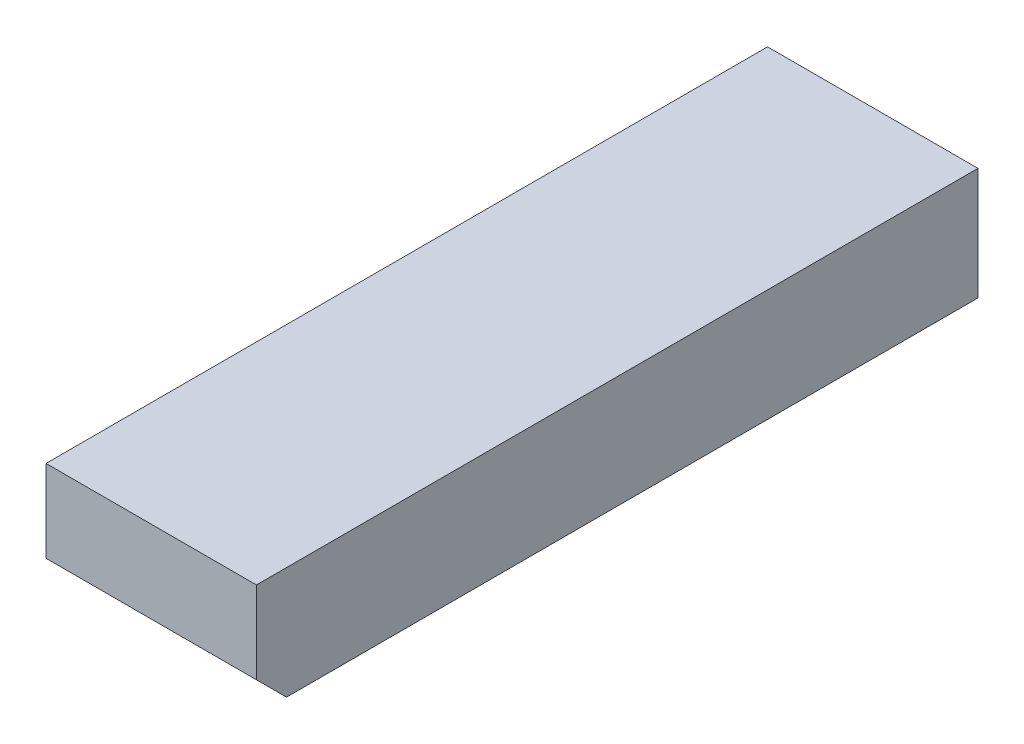
ISO-10303-21;
HEADER;
FILE_DESCRIPTION(('STEP AP214'),'2;1');
FILE_NAME('part.step','',(''),(''),'','','');
FILE_SCHEMA(('AUTOMOTIVE_DESIGN { 1 0 10303 214 1 1 1 1 }'));
ENDSEC;
DATA;
#1=APPLICATION_CONTEXT('core data for automotive mechanical design processes');
#2=APPLICATION_PROTOCOL_DEFINITION('international standard','automotive_design',2000,#1);
#3=PRODUCT_CONTEXT('',#1,'mechanical');
#4=PRODUCT('Part','Part','',(#3));
#5=PRODUCT_RELATED_PRODUCT_CATEGORY('part','',(#4));
#6=PRODUCT_DEFINITION_FORMATION('','',#4);
#7=PRODUCT_DEFINITION_CONTEXT('part definition',#1,'design');
#8=PRODUCT_DEFINITION('design','',#6,#7);
#9=PRODUCT_DEFINITION_SHAPE('','',#8);
#10=(LENGTH_UNIT() NAMED_UNIT(*) SI_UNIT(.MILLI.,.METRE.));
#11=(NAMED_UNIT(*) PLANE_ANGLE_UNIT() SI_UNIT($,.RADIAN.));
#12=(NAMED_UNIT(*) SI_UNIT($,.STERADIAN.) SOLID_ANGLE_UNIT());
#13=UNCERTAINTY_MEASURE_WITH_UNIT(LENGTH_MEASURE(1.E-05),#10,'distance_accuracy_value','');
#14=(GEOMETRIC_REPRESENTATION_CONTEXT(3) GLOBAL_UNCERTAINTY_ASSIGNED_CONTEXT((#13)) GLOBAL_UNIT_ASSIGNED_CONTEXT((#10,
#11,#12)) REPRESENTATION_CONTEXT('',''));
#15=CARTESIAN_POINT('',(0.,0.,0.));
#16=DIRECTION('',(0.,0.,1.));
#17=DIRECTION('',(1.,0.,0.));
#18=AXIS2_PLACEMENT_3D('',#15,#16,#17);
#19=CARTESIAN_POINT('',(0.,0.,91.44));
#20=DIRECTION('',(1.,0.,0.));
#21=DIRECTION('',(0.,0.,-1.));
#22=AXIS2_PLACEMENT_3D('',#19,#20,#21);
#23=PLANE('',#22);
#24=DIRECTION('',(0.,0.,-1.));
#25=VECTOR('',#24,1.);
#26=CARTESIAN_POINT('',(0.,0.,91.44));
#27=LINE('',#26,#25);
#28=CARTESIAN_POINT('',(0.,0.,87.63));
#29=VERTEX_POINT('',#28);
#30=CARTESIAN_POINT('',(0.,0.,0.));
#31=VERTEX_POINT('',#30);
#32=EDGE_CURVE('E120',#29,#31,#27,.T.);
#33=ORIENTED_EDGE('',*,*,#32,.F.);
#34=DIRECTION('',(0.,-0.707106781186546,-0.707106781186549));
#35=VECTOR('',#34,1.);
#36=CARTESIAN_POINT('',(0.,3.80999999999999,91.44));
#37=LINE('',#36,#35);
#38=CARTESIAN_POINT('',(0.,3.80999999999999,91.44));
#39=VERTEX_POINT('',#38);
#40=EDGE_CURVE('E11',#29,#39,#37,.F.);
#41=ORIENTED_EDGE('',*,*,#40,.T.);
#42=DIRECTION('',(0.,-1.,0.));
#43=VECTOR('',#42,1.);
#44=CARTESIAN_POINT('',(0.,0.,91.44));
#45=LINE('',#44,#43);
#46=CARTESIAN_POINT('',(0.,14.224,91.44));
#47=VERTEX_POINT('',#46);
#48=EDGE_CURVE('E91',#47,#39,#45,.T.);
#49=ORIENTED_EDGE('',*,*,#48,.F.);
#50=DIRECTION('',(0.,0.,-1.));
#51=VECTOR('',#50,1.);
#52=CARTESIAN_POINT('',(0.,14.224,91.44));
#53=LINE('',#52,#51);
#54=CARTESIAN_POINT('',(0.,14.224,0.));
#55=VERTEX_POINT('',#54);
#56=EDGE_CURVE('E101',#47,#55,#53,.T.);
#57=ORIENTED_EDGE('',*,*,#56,.T.);
#58=DIRECTION('',(0.,-1.,0.));
#59=VECTOR('',#58,1.);
#60=CARTESIAN_POINT('',(0.,0.,0.));
#61=LINE('',#60,#59);
#62=EDGE_CURVE('E110',#55,#31,#61,.T.);
#63=ORIENTED_EDGE('',*,*,#62,.T.);
#64=EDGE_LOOP('',(#33,#41,#49,#57,#63));
#65=FACE_BOUND('',#64,.T.);
#66=ADVANCED_FACE('F38',(#65),#23,.F.);
#67=CARTESIAN_POINT('',(0.,0.,91.44));
#68=DIRECTION('',(0.,1.,0.));
#69=DIRECTION('',(0.,0.,1.));
#70=AXIS2_PLACEMENT_3D('',#67,#68,#69);
#71=PLANE('',#70);
#72=DIRECTION('',(0.,0.,-1.));
#73=VECTOR('',#72,1.);
#74=CARTESIAN_POINT('',(26.67,0.,91.44));
#75=LINE('',#74,#73);
#76=CARTESIAN_POINT('',(26.67,0.,87.63));
#77=VERTEX_POINT('',#76);
#78=CARTESIAN_POINT('',(26.67,0.,0.));
#79=VERTEX_POINT('',#78);
#80=EDGE_CURVE('E100',#77,#79,#75,.T.);
#81=ORIENTED_EDGE('',*,*,#80,.F.);
#82=DIRECTION('',(-1.,0.,0.));
#83=VECTOR('',#82,1.);
#84=CARTESIAN_POINT('',(0.,0.,87.63));
#85=LINE('',#84,#83);
#86=EDGE_CURVE('E46',#77,#29,#85,.T.);
#87=ORIENTED_EDGE('',*,*,#86,.T.);
#88=ORIENTED_EDGE('',*,*,#32,.T.);
#89=DIRECTION('',(1.,0.,0.));
#90=VECTOR('',#89,1.);
#91=CARTESIAN_POINT('',(0.,0.,0.));
#92=LINE('',#91,#90);
#93=EDGE_CURVE('E113',#31,#79,#92,.T.);
#94=ORIENTED_EDGE('',*,*,#93,.T.);
#95=EDGE_LOOP('',(#81,#87,#88,#94));
#96=FACE_BOUND('',#95,.T.);
#97=ADVANCED_FACE('F124',(#96),#71,.F.);
#98=CARTESIAN_POINT('',(26.67,0.,91.44));
#99=DIRECTION('',(-1.,0.,0.));
#100=DIRECTION('',(0.,0.,1.));
#101=AXIS2_PLACEMENT_3D('',#98,#99,#100);
#102=PLANE('',#101);
#103=DIRECTION('',(0.,1.,0.));
#104=VECTOR('',#103,1.);
#105=CARTESIAN_POINT('',(26.67,0.,91.44));
#106=LINE('',#105,#104);
#107=CARTESIAN_POINT('',(26.67,3.80999999999999,91.44));
#108=VERTEX_POINT('',#107);
#109=CARTESIAN_POINT('',(26.67,14.224,91.44));
#110=VERTEX_POINT('',#109);
#111=EDGE_CURVE('E82',#108,#110,#106,.T.);
#112=ORIENTED_EDGE('',*,*,#111,.F.);
#113=DIRECTION('',(0.,0.707106781186546,0.707106781186549));
#114=VECTOR('',#113,1.);
#115=CARTESIAN_POINT('',(26.67,3.80999999999999,91.44));
#116=LINE('',#115,#114);
#117=EDGE_CURVE('E60',#108,#77,#116,.F.);
#118=ORIENTED_EDGE('',*,*,#117,.T.);
#119=ORIENTED_EDGE('',*,*,#80,.T.);
#120=DIRECTION('',(0.,1.,0.));
#121=VECTOR('',#120,1.);
#122=CARTESIAN_POINT('',(26.67,0.,0.));
#123=LINE('',#122,#121);
#124=CARTESIAN_POINT('',(26.67,14.224,0.));
#125=VERTEX_POINT('',#124);
#126=EDGE_CURVE('E97',#79,#125,#123,.T.);
#127=ORIENTED_EDGE('',*,*,#126,.T.);
#128=DIRECTION('',(0.,0.,-1.));
#129=VECTOR('',#128,1.);
#130=CARTESIAN_POINT('',(26.67,14.224,91.44));
#131=LINE('',#130,#129);
#132=EDGE_CURVE('E94',#110,#125,#131,.T.);
#133=ORIENTED_EDGE('',*,*,#132,.F.);
#134=EDGE_LOOP('',(#112,#118,#119,#127,#133));
#135=FACE_BOUND('',#134,.T.);
#136=ADVANCED_FACE('F95',(#135),#102,.F.);
#137=CARTESIAN_POINT('',(0.,14.224,91.44));
#138=DIRECTION('',(0.,-1.,0.));
#139=DIRECTION('',(0.,0.,-1.));
#140=AXIS2_PLACEMENT_3D('',#137,#138,#139);
#141=PLANE('',#140);
#142=DIRECTION('',(-1.,0.,0.));
#143=VECTOR('',#142,1.);
#144=CARTESIAN_POINT('',(0.,14.224,0.));
#145=LINE('',#144,#143);
#146=EDGE_CURVE('E117',#125,#55,#145,.T.);
#147=ORIENTED_EDGE('',*,*,#146,.T.);
#148=ORIENTED_EDGE('',*,*,#56,.F.);
#149=DIRECTION('',(-1.,0.,0.));
#150=VECTOR('',#149,1.);
#151=CARTESIAN_POINT('',(0.,14.224,91.44));
#152=LINE('',#151,#150);
#153=EDGE_CURVE('E87',#110,#47,#152,.T.);
#154=ORIENTED_EDGE('',*,*,#153,.F.);
#155=ORIENTED_EDGE('',*,*,#132,.T.);
#156=EDGE_LOOP('',(#147,#148,#154,#155));
#157=FACE_BOUND('',#156,.T.);
#158=ADVANCED_FACE('F103',(#157),#141,.F.);
#159=CARTESIAN_POINT('',(0.,14.224,91.44));
#160=DIRECTION('',(0.,0.,-1.));
#161=DIRECTION('',(-1.,0.,0.));
#162=AXIS2_PLACEMENT_3D('',#159,#160,#161);
#163=PLANE('',#162);
#164=ORIENTED_EDGE('',*,*,#48,.T.);
#165=DIRECTION('',(1.,0.,0.));
#166=VECTOR('',#165,1.);
#167=CARTESIAN_POINT('',(0.,3.80999999999999,91.44));
#168=LINE('',#167,#166);
#169=EDGE_CURVE('E90',#39,#108,#168,.T.);
#170=ORIENTED_EDGE('',*,*,#169,.T.);
#171=ORIENTED_EDGE('',*,*,#111,.T.);
#172=ORIENTED_EDGE('',*,*,#153,.T.);
#173=EDGE_LOOP('',(#164,#170,#171,#172));
#174=FACE_BOUND('',#173,.T.);
#175=ADVANCED_FACE('F85',(#174),#163,.F.);
#176=CARTESIAN_POINT('',(0.,14.224,0.));
#177=DIRECTION('',(0.,0.,-1.));
#178=DIRECTION('',(-1.,0.,0.));
#179=AXIS2_PLACEMENT_3D('',#176,#177,#178);
#180=PLANE('',#179);
#181=ORIENTED_EDGE('',*,*,#62,.F.);
#182=ORIENTED_EDGE('',*,*,#146,.F.);
#183=ORIENTED_EDGE('',*,*,#126,.F.);
#184=ORIENTED_EDGE('',*,*,#93,.F.);
#185=EDGE_LOOP('',(#181,#182,#183,#184));
#186=FACE_BOUND('',#185,.T.);
#187=ADVANCED_FACE('F129',(#186),#180,.T.);
#188=CARTESIAN_POINT('',(0.,3.80999999999999,91.44));
#189=DIRECTION('',(0.,0.707106781186549,-0.707106781186546));
#190=DIRECTION('',(0.,0.707106781186546,0.707106781186549));
#191=AXIS2_PLACEMENT_3D('',#188,#189,#190);
#192=PLANE('',#191);
#193=ORIENTED_EDGE('',*,*,#40,.F.);
#194=ORIENTED_EDGE('',*,*,#86,.F.);
#195=ORIENTED_EDGE('',*,*,#117,.F.);
#196=ORIENTED_EDGE('',*,*,#169,.F.);
#197=EDGE_LOOP('',(#193,#194,#195,#196));
#198=FACE_BOUND('',#197,.T.);
#199=ADVANCED_FACE('F40',(#198),#192,.F.);
#200=CLOSED_SHELL('',(#66,#97,#136,#158,#175,#187,#199));
#201=MANIFOLD_SOLID_BREP('B2',#200);
#202=ADVANCED_BREP_SHAPE_REPRESENTATION('',(#18,#201),#14);
#203=SHAPE_DEFINITION_REPRESENTATION(#9,#202);
ENDSEC;
END-ISO-10303-21;
